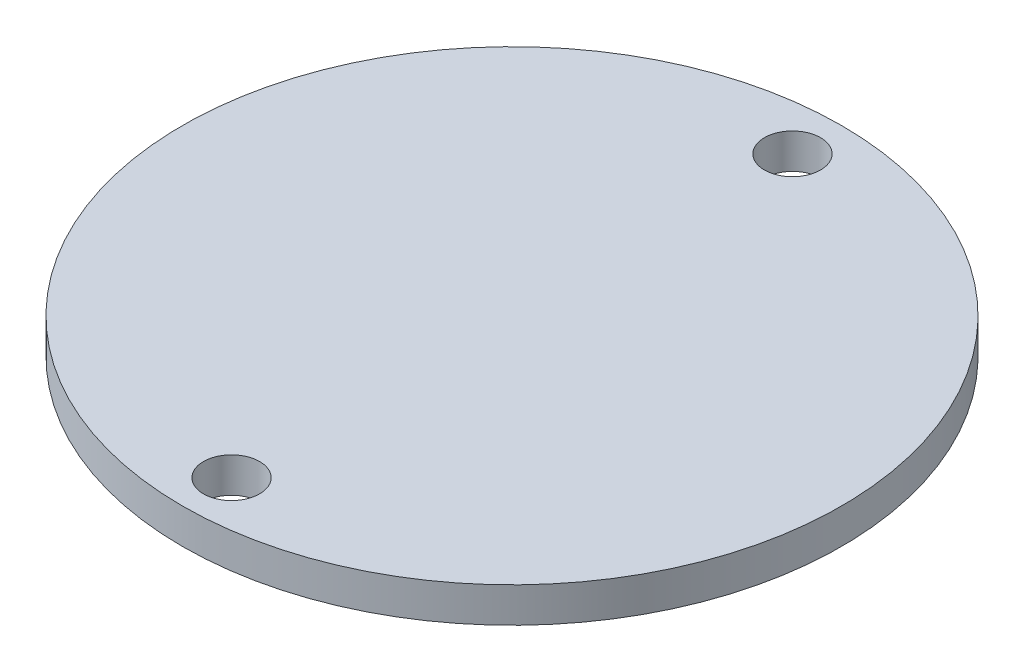
ISO-10303-21;
HEADER;
FILE_DESCRIPTION(('STEP AP214'),'2;1');
FILE_NAME('part.step','',(''),(''),'','','');
FILE_SCHEMA(('AUTOMOTIVE_DESIGN { 1 0 10303 214 1 1 1 1 }'));
ENDSEC;
DATA;
#1=APPLICATION_CONTEXT('core data for automotive mechanical design processes');
#2=APPLICATION_PROTOCOL_DEFINITION('international standard','automotive_design',2000,#1);
#3=PRODUCT_CONTEXT('',#1,'mechanical');
#4=PRODUCT('Part','Part','',(#3));
#5=PRODUCT_RELATED_PRODUCT_CATEGORY('part','',(#4));
#6=PRODUCT_DEFINITION_FORMATION('','',#4);
#7=PRODUCT_DEFINITION_CONTEXT('part definition',#1,'design');
#8=PRODUCT_DEFINITION('design','',#6,#7);
#9=PRODUCT_DEFINITION_SHAPE('','',#8);
#10=(LENGTH_UNIT() NAMED_UNIT(*) SI_UNIT(.MILLI.,.METRE.));
#11=(NAMED_UNIT(*) PLANE_ANGLE_UNIT() SI_UNIT($,.RADIAN.));
#12=(NAMED_UNIT(*) SI_UNIT($,.STERADIAN.) SOLID_ANGLE_UNIT());
#13=UNCERTAINTY_MEASURE_WITH_UNIT(LENGTH_MEASURE(1.E-05),#10,'distance_accuracy_value','');
#14=(GEOMETRIC_REPRESENTATION_CONTEXT(3) GLOBAL_UNCERTAINTY_ASSIGNED_CONTEXT((#13)) GLOBAL_UNIT_ASSIGNED_CONTEXT((#10,
#11,#12)) REPRESENTATION_CONTEXT('',''));
#15=CARTESIAN_POINT('',(0.,0.,0.));
#16=DIRECTION('',(0.,0.,1.));
#17=DIRECTION('',(1.,0.,0.));
#18=AXIS2_PLACEMENT_3D('',#15,#16,#17);
#19=CARTESIAN_POINT('',(0.,2.5,0.));
#20=DIRECTION('',(0.,1.,0.));
#21=DIRECTION('',(0.,0.,1.));
#22=AXIS2_PLACEMENT_3D('',#19,#20,#21);
#23=PLANE('',#22);
#24=CARTESIAN_POINT('',(0.,2.5,20.));
#25=DIRECTION('',(0.,1.,0.));
#26=DIRECTION('',(0.,0.,1.));
#27=AXIS2_PLACEMENT_3D('',#24,#25,#26);
#28=CIRCLE('',#27,2.);
#29=CARTESIAN_POINT('',(0.,2.5,22.));
#30=VERTEX_POINT('',#29);
#31=EDGE_CURVE('E50',#30,#30,#28,.T.);
#32=ORIENTED_EDGE('',*,*,#31,.F.);
#33=EDGE_LOOP('',(#32));
#34=FACE_BOUND('',#33,.T.);
#35=CARTESIAN_POINT('',(0.,2.5,0.));
#36=DIRECTION('',(0.,1.,0.));
#37=DIRECTION('',(0.,0.,1.));
#38=AXIS2_PLACEMENT_3D('',#35,#36,#37);
#39=CIRCLE('',#38,23.5);
#40=CARTESIAN_POINT('',(0.,2.5,23.5));
#41=VERTEX_POINT('',#40);
#42=EDGE_CURVE('E10',#41,#41,#39,.T.);
#43=ORIENTED_EDGE('',*,*,#42,.T.);
#44=EDGE_LOOP('',(#43));
#45=FACE_BOUND('',#44,.T.);
#46=CARTESIAN_POINT('',(0.,2.5,-20.));
#47=DIRECTION('',(0.,1.,0.));
#48=DIRECTION('',(0.,0.,1.));
#49=AXIS2_PLACEMENT_3D('',#46,#47,#48);
#50=CIRCLE('',#49,2.);
#51=CARTESIAN_POINT('',(0.,2.5,-18.));
#52=VERTEX_POINT('',#51);
#53=EDGE_CURVE('E56',#52,#52,#50,.T.);
#54=ORIENTED_EDGE('',*,*,#53,.F.);
#55=EDGE_LOOP('',(#54));
#56=FACE_BOUND('',#55,.T.);
#57=ADVANCED_FACE('F37',(#34,#45,#56),#23,.T.);
#58=CARTESIAN_POINT('',(0.,0.,0.));
#59=DIRECTION('',(0.,1.,0.));
#60=DIRECTION('',(0.,0.,1.));
#61=AXIS2_PLACEMENT_3D('',#58,#59,#60);
#62=PLANE('',#61);
#63=CARTESIAN_POINT('',(0.,0.,0.));
#64=DIRECTION('',(0.,1.,0.));
#65=DIRECTION('',(0.,0.,1.));
#66=AXIS2_PLACEMENT_3D('',#63,#64,#65);
#67=CIRCLE('',#66,23.5);
#68=CARTESIAN_POINT('',(0.,0.,23.5));
#69=VERTEX_POINT('',#68);
#70=EDGE_CURVE('E41',#69,#69,#67,.T.);
#71=ORIENTED_EDGE('',*,*,#70,.F.);
#72=EDGE_LOOP('',(#71));
#73=FACE_BOUND('',#72,.T.);
#74=CARTESIAN_POINT('',(0.,0.,20.));
#75=DIRECTION('',(0.,1.,0.));
#76=DIRECTION('',(0.,0.,1.));
#77=AXIS2_PLACEMENT_3D('',#74,#75,#76);
#78=CIRCLE('',#77,2.);
#79=CARTESIAN_POINT('',(0.,0.,22.));
#80=VERTEX_POINT('',#79);
#81=EDGE_CURVE('E52',#80,#80,#78,.T.);
#82=ORIENTED_EDGE('',*,*,#81,.T.);
#83=EDGE_LOOP('',(#82));
#84=FACE_BOUND('',#83,.T.);
#85=CARTESIAN_POINT('',(0.,0.,-20.));
#86=DIRECTION('',(0.,1.,0.));
#87=DIRECTION('',(0.,0.,1.));
#88=AXIS2_PLACEMENT_3D('',#85,#86,#87);
#89=CIRCLE('',#88,2.);
#90=CARTESIAN_POINT('',(0.,0.,-18.));
#91=VERTEX_POINT('',#90);
#92=EDGE_CURVE('E60',#91,#91,#89,.T.);
#93=ORIENTED_EDGE('',*,*,#92,.T.);
#94=EDGE_LOOP('',(#93));
#95=FACE_BOUND('',#94,.T.);
#96=ADVANCED_FACE('F72',(#73,#84,#95),#62,.F.);
#97=CARTESIAN_POINT('',(0.,2.5,0.));
#98=DIRECTION('',(0.,-1.,0.));
#99=DIRECTION('',(0.,0.,-1.));
#100=AXIS2_PLACEMENT_3D('',#97,#98,#99);
#101=CYLINDRICAL_SURFACE('',#100,23.5);
#102=ORIENTED_EDGE('',*,*,#42,.F.);
#103=EDGE_LOOP('',(#102));
#104=FACE_BOUND('',#103,.T.);
#105=ORIENTED_EDGE('',*,*,#70,.T.);
#106=EDGE_LOOP('',(#105));
#107=FACE_BOUND('',#106,.T.);
#108=ADVANCED_FACE('F39',(#104,#107),#101,.T.);
#109=CARTESIAN_POINT('',(0.,2.5,20.));
#110=DIRECTION('',(0.,-1.,0.));
#111=DIRECTION('',(0.,0.,-1.));
#112=AXIS2_PLACEMENT_3D('',#109,#110,#111);
#113=CYLINDRICAL_SURFACE('',#112,2.);
#114=ORIENTED_EDGE('',*,*,#31,.T.);
#115=EDGE_LOOP('',(#114));
#116=FACE_BOUND('',#115,.T.);
#117=ORIENTED_EDGE('',*,*,#81,.F.);
#118=EDGE_LOOP('',(#117));
#119=FACE_BOUND('',#118,.T.);
#120=ADVANCED_FACE('F81',(#116,#119),#113,.F.);
#121=CARTESIAN_POINT('',(0.,2.5,-20.));
#122=DIRECTION('',(0.,-1.,0.));
#123=DIRECTION('',(0.,0.,-1.));
#124=AXIS2_PLACEMENT_3D('',#121,#122,#123);
#125=CYLINDRICAL_SURFACE('',#124,2.);
#126=ORIENTED_EDGE('',*,*,#53,.T.);
#127=EDGE_LOOP('',(#126));
#128=FACE_BOUND('',#127,.T.);
#129=ORIENTED_EDGE('',*,*,#92,.F.);
#130=EDGE_LOOP('',(#129));
#131=FACE_BOUND('',#130,.T.);
#132=ADVANCED_FACE('F68',(#128,#131),#125,.F.);
#133=CLOSED_SHELL('',(#57,#96,#108,#120,#132));
#134=MANIFOLD_SOLID_BREP('B2',#133);
#135=ADVANCED_BREP_SHAPE_REPRESENTATION('',(#18,#134),#14);
#136=SHAPE_DEFINITION_REPRESENTATION(#9,#135);
ENDSEC;
END-ISO-10303-21;
